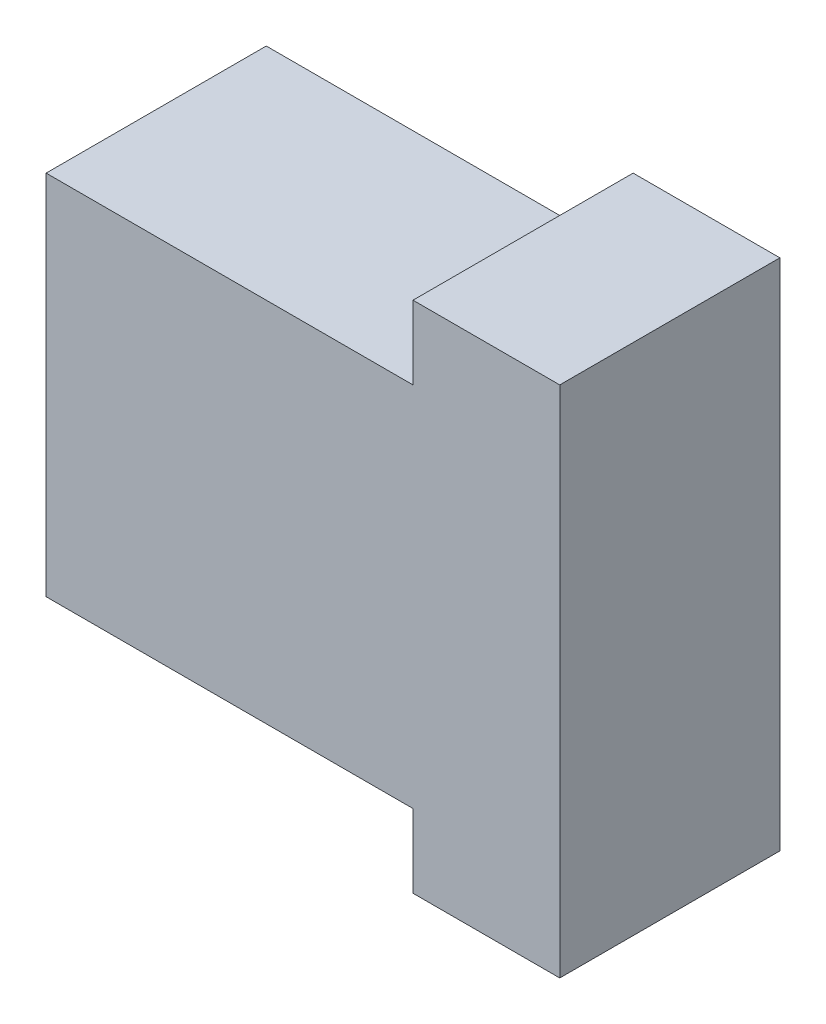
ISO-10303-21;
HEADER;
FILE_DESCRIPTION(('STEP AP214'),'2;1');
FILE_NAME('part.step','',(''),(''),'','','');
FILE_SCHEMA(('AUTOMOTIVE_DESIGN { 1 0 10303 214 1 1 1 1 }'));
ENDSEC;
DATA;
#1=APPLICATION_CONTEXT('core data for automotive mechanical design processes');
#2=APPLICATION_PROTOCOL_DEFINITION('international standard','automotive_design',2000,#1);
#3=PRODUCT_CONTEXT('',#1,'mechanical');
#4=PRODUCT('Part','Part','',(#3));
#5=PRODUCT_RELATED_PRODUCT_CATEGORY('part','',(#4));
#6=PRODUCT_DEFINITION_FORMATION('','',#4);
#7=PRODUCT_DEFINITION_CONTEXT('part definition',#1,'design');
#8=PRODUCT_DEFINITION('design','',#6,#7);
#9=PRODUCT_DEFINITION_SHAPE('','',#8);
#10=(LENGTH_UNIT() NAMED_UNIT(*) SI_UNIT(.MILLI.,.METRE.));
#11=(NAMED_UNIT(*) PLANE_ANGLE_UNIT() SI_UNIT($,.RADIAN.));
#12=(NAMED_UNIT(*) SI_UNIT($,.STERADIAN.) SOLID_ANGLE_UNIT());
#13=UNCERTAINTY_MEASURE_WITH_UNIT(LENGTH_MEASURE(1.E-05),#10,'distance_accuracy_value','');
#14=(GEOMETRIC_REPRESENTATION_CONTEXT(3) GLOBAL_UNCERTAINTY_ASSIGNED_CONTEXT((#13)) GLOBAL_UNIT_ASSIGNED_CONTEXT((#10,
#11,#12)) REPRESENTATION_CONTEXT('',''));
#15=CARTESIAN_POINT('',(0.,0.,0.));
#16=DIRECTION('',(0.,0.,1.));
#17=DIRECTION('',(1.,0.,0.));
#18=AXIS2_PLACEMENT_3D('',#15,#16,#17);
#19=CARTESIAN_POINT('',(0.,3.00225749709108,3.));
#20=DIRECTION('',(0.,1.,0.));
#21=DIRECTION('',(0.,0.,1.));
#22=AXIS2_PLACEMENT_3D('',#19,#20,#21);
#23=PLANE('',#22);
#24=DIRECTION('',(1.,0.,0.));
#25=VECTOR('',#24,1.);
#26=CARTESIAN_POINT('',(0.,3.00225749709108,0.));
#27=LINE('',#26,#25);
#28=CARTESIAN_POINT('',(-12.9538492447736,3.00225749709108,0.));
#29=VERTEX_POINT('',#28);
#30=CARTESIAN_POINT('',(-7.95384924477364,3.00225749709108,0.));
#31=VERTEX_POINT('',#30);
#32=EDGE_CURVE('E147',#29,#31,#27,.T.);
#33=ORIENTED_EDGE('',*,*,#32,.T.);
#34=DIRECTION('',(0.,0.,-1.));
#35=VECTOR('',#34,1.);
#36=CARTESIAN_POINT('',(-7.95384924477364,3.00225749709108,3.));
#37=LINE('',#36,#35);
#38=CARTESIAN_POINT('',(-7.95384924477364,3.00225749709108,3.));
#39=VERTEX_POINT('',#38);
#40=EDGE_CURVE('E11',#39,#31,#37,.T.);
#41=ORIENTED_EDGE('',*,*,#40,.F.);
#42=DIRECTION('',(1.,0.,0.));
#43=VECTOR('',#42,1.);
#44=CARTESIAN_POINT('',(0.,3.00225749709108,3.));
#45=LINE('',#44,#43);
#46=CARTESIAN_POINT('',(-12.9538492447736,3.00225749709108,3.));
#47=VERTEX_POINT('',#46);
#48=EDGE_CURVE('E169',#47,#39,#45,.T.);
#49=ORIENTED_EDGE('',*,*,#48,.F.);
#50=DIRECTION('',(0.,0.,-1.));
#51=VECTOR('',#50,1.);
#52=CARTESIAN_POINT('',(-12.9538492447736,3.00225749709108,3.));
#53=LINE('',#52,#51);
#54=EDGE_CURVE('E141',#47,#29,#53,.T.);
#55=ORIENTED_EDGE('',*,*,#54,.T.);
#56=EDGE_LOOP('',(#33,#41,#49,#55));
#57=FACE_BOUND('',#56,.T.);
#58=ADVANCED_FACE('F44',(#57),#23,.F.);
#59=CARTESIAN_POINT('',(-7.95384924477364,0.,3.));
#60=DIRECTION('',(1.,0.,0.));
#61=DIRECTION('',(0.,1.,0.));
#62=AXIS2_PLACEMENT_3D('',#59,#60,#61);
#63=PLANE('',#62);
#64=DIRECTION('',(0.,-1.,0.));
#65=VECTOR('',#64,1.);
#66=CARTESIAN_POINT('',(-7.95384924477364,0.,0.));
#67=LINE('',#66,#65);
#68=CARTESIAN_POINT('',(-7.95384924477364,2.00225749709108,0.));
#69=VERTEX_POINT('',#68);
#70=EDGE_CURVE('E148',#31,#69,#67,.T.);
#71=ORIENTED_EDGE('',*,*,#70,.T.);
#72=DIRECTION('',(0.,0.,-1.));
#73=VECTOR('',#72,1.);
#74=CARTESIAN_POINT('',(-7.95384924477364,2.00225749709108,3.));
#75=LINE('',#74,#73);
#76=CARTESIAN_POINT('',(-7.95384924477364,2.00225749709108,3.));
#77=VERTEX_POINT('',#76);
#78=EDGE_CURVE('E53',#77,#69,#75,.T.);
#79=ORIENTED_EDGE('',*,*,#78,.F.);
#80=DIRECTION('',(0.,-1.,0.));
#81=VECTOR('',#80,1.);
#82=CARTESIAN_POINT('',(-7.95384924477364,0.,3.));
#83=LINE('',#82,#81);
#84=EDGE_CURVE('E102',#39,#77,#83,.T.);
#85=ORIENTED_EDGE('',*,*,#84,.F.);
#86=ORIENTED_EDGE('',*,*,#40,.T.);
#87=EDGE_LOOP('',(#71,#79,#85,#86));
#88=FACE_BOUND('',#87,.T.);
#89=ADVANCED_FACE('F208',(#88),#63,.F.);
#90=CARTESIAN_POINT('',(0.,2.00225749709108,3.));
#91=DIRECTION('',(0.,1.,0.));
#92=DIRECTION('',(-1.,0.,0.));
#93=AXIS2_PLACEMENT_3D('',#90,#91,#92);
#94=PLANE('',#93);
#95=DIRECTION('',(1.,0.,0.));
#96=VECTOR('',#95,1.);
#97=CARTESIAN_POINT('',(0.,2.00225749709108,0.));
#98=LINE('',#97,#96);
#99=CARTESIAN_POINT('',(-5.95384924477365,2.00225749709108,0.));
#100=VERTEX_POINT('',#99);
#101=EDGE_CURVE('E154',#69,#100,#98,.T.);
#102=ORIENTED_EDGE('',*,*,#101,.T.);
#103=DIRECTION('',(0.,0.,-1.));
#104=VECTOR('',#103,1.);
#105=CARTESIAN_POINT('',(-5.95384924477365,2.00225749709108,3.));
#106=LINE('',#105,#104);
#107=CARTESIAN_POINT('',(-5.95384924477365,2.00225749709108,3.));
#108=VERTEX_POINT('',#107);
#109=EDGE_CURVE('E179',#108,#100,#106,.T.);
#110=ORIENTED_EDGE('',*,*,#109,.F.);
#111=DIRECTION('',(1.,0.,0.));
#112=VECTOR('',#111,1.);
#113=CARTESIAN_POINT('',(0.,2.00225749709108,3.));
#114=LINE('',#113,#112);
#115=EDGE_CURVE('E188',#77,#108,#114,.T.);
#116=ORIENTED_EDGE('',*,*,#115,.F.);
#117=ORIENTED_EDGE('',*,*,#78,.T.);
#118=EDGE_LOOP('',(#102,#110,#116,#117));
#119=FACE_BOUND('',#118,.T.);
#120=ADVANCED_FACE('F190',(#119),#94,.F.);
#121=CARTESIAN_POINT('',(-5.95384924477365,0.,3.));
#122=DIRECTION('',(1.,0.,0.));
#123=DIRECTION('',(0.,0.,-1.));
#124=AXIS2_PLACEMENT_3D('',#121,#122,#123);
#125=PLANE('',#124);
#126=DIRECTION('',(0.,-1.,0.));
#127=VECTOR('',#126,1.);
#128=CARTESIAN_POINT('',(-5.95384924477365,0.,0.));
#129=LINE('',#128,#127);
#130=CARTESIAN_POINT('',(-5.95384924477365,9.00225749709108,0.));
#131=VERTEX_POINT('',#130);
#132=EDGE_CURVE('E160',#131,#100,#129,.T.);
#133=ORIENTED_EDGE('',*,*,#132,.F.);
#134=DIRECTION('',(0.,0.,-1.));
#135=VECTOR('',#134,1.);
#136=CARTESIAN_POINT('',(-5.95384924477365,9.00225749709108,3.));
#137=LINE('',#136,#135);
#138=CARTESIAN_POINT('',(-5.95384924477365,9.00225749709108,3.));
#139=VERTEX_POINT('',#138);
#140=EDGE_CURVE('E180',#139,#131,#137,.T.);
#141=ORIENTED_EDGE('',*,*,#140,.F.);
#142=DIRECTION('',(0.,-1.,0.));
#143=VECTOR('',#142,1.);
#144=CARTESIAN_POINT('',(-5.95384924477365,0.,3.));
#145=LINE('',#144,#143);
#146=EDGE_CURVE('E199',#139,#108,#145,.T.);
#147=ORIENTED_EDGE('',*,*,#146,.T.);
#148=ORIENTED_EDGE('',*,*,#109,.T.);
#149=EDGE_LOOP('',(#133,#141,#147,#148));
#150=FACE_BOUND('',#149,.T.);
#151=ADVANCED_FACE('F196',(#150),#125,.T.);
#152=CARTESIAN_POINT('',(0.,9.00225749709108,3.));
#153=DIRECTION('',(0.,1.,0.));
#154=DIRECTION('',(0.,0.,1.));
#155=AXIS2_PLACEMENT_3D('',#152,#153,#154);
#156=PLANE('',#155);
#157=DIRECTION('',(1.,0.,0.));
#158=VECTOR('',#157,1.);
#159=CARTESIAN_POINT('',(0.,9.00225749709108,0.));
#160=LINE('',#159,#158);
#161=CARTESIAN_POINT('',(-7.95384924477365,9.00225749709108,0.));
#162=VERTEX_POINT('',#161);
#163=EDGE_CURVE('E161',#162,#131,#160,.T.);
#164=ORIENTED_EDGE('',*,*,#163,.F.);
#165=DIRECTION('',(0.,0.,-1.));
#166=VECTOR('',#165,1.);
#167=CARTESIAN_POINT('',(-7.95384924477365,9.00225749709108,3.));
#168=LINE('',#167,#166);
#169=CARTESIAN_POINT('',(-7.95384924477365,9.00225749709108,3.));
#170=VERTEX_POINT('',#169);
#171=EDGE_CURVE('E134',#170,#162,#168,.T.);
#172=ORIENTED_EDGE('',*,*,#171,.F.);
#173=DIRECTION('',(1.,0.,0.));
#174=VECTOR('',#173,1.);
#175=CARTESIAN_POINT('',(0.,9.00225749709108,3.));
#176=LINE('',#175,#174);
#177=EDGE_CURVE('E122',#170,#139,#176,.T.);
#178=ORIENTED_EDGE('',*,*,#177,.T.);
#179=ORIENTED_EDGE('',*,*,#140,.T.);
#180=EDGE_LOOP('',(#164,#172,#178,#179));
#181=FACE_BOUND('',#180,.T.);
#182=ADVANCED_FACE('F219',(#181),#156,.T.);
#183=CARTESIAN_POINT('',(-7.95384924477364,8.00225749709108,0.));
#184=VERTEX_POINT('',#183);
#185=EDGE_CURVE('E127',#162,#184,#67,.T.);
#186=ORIENTED_EDGE('',*,*,#185,.T.);
#187=DIRECTION('',(0.,0.,-1.));
#188=VECTOR('',#187,1.);
#189=CARTESIAN_POINT('',(-7.95384924477364,8.00225749709108,3.));
#190=LINE('',#189,#188);
#191=CARTESIAN_POINT('',(-7.95384924477364,8.00225749709108,3.));
#192=VERTEX_POINT('',#191);
#193=EDGE_CURVE('E130',#192,#184,#190,.T.);
#194=ORIENTED_EDGE('',*,*,#193,.F.);
#195=EDGE_CURVE('E113',#170,#192,#83,.T.);
#196=ORIENTED_EDGE('',*,*,#195,.F.);
#197=ORIENTED_EDGE('',*,*,#171,.T.);
#198=EDGE_LOOP('',(#186,#194,#196,#197));
#199=FACE_BOUND('',#198,.T.);
#200=ADVANCED_FACE('F126',(#199),#63,.F.);
#201=CARTESIAN_POINT('',(0.,8.00225749709108,3.));
#202=DIRECTION('',(0.,1.,0.));
#203=DIRECTION('',(0.,0.,1.));
#204=AXIS2_PLACEMENT_3D('',#201,#202,#203);
#205=PLANE('',#204);
#206=DIRECTION('',(1.,0.,0.));
#207=VECTOR('',#206,1.);
#208=CARTESIAN_POINT('',(0.,8.00225749709108,0.));
#209=LINE('',#208,#207);
#210=CARTESIAN_POINT('',(-12.9538492447736,8.00225749709108,0.));
#211=VERTEX_POINT('',#210);
#212=EDGE_CURVE('E165',#211,#184,#209,.T.);
#213=ORIENTED_EDGE('',*,*,#212,.F.);
#214=DIRECTION('',(0.,0.,-1.));
#215=VECTOR('',#214,1.);
#216=CARTESIAN_POINT('',(-12.9538492447736,8.00225749709108,3.));
#217=LINE('',#216,#215);
#218=CARTESIAN_POINT('',(-12.9538492447736,8.00225749709108,3.));
#219=VERTEX_POINT('',#218);
#220=EDGE_CURVE('E89',#219,#211,#217,.T.);
#221=ORIENTED_EDGE('',*,*,#220,.F.);
#222=DIRECTION('',(1.,0.,0.));
#223=VECTOR('',#222,1.);
#224=CARTESIAN_POINT('',(0.,8.00225749709108,3.));
#225=LINE('',#224,#223);
#226=EDGE_CURVE('E118',#219,#192,#225,.T.);
#227=ORIENTED_EDGE('',*,*,#226,.T.);
#228=ORIENTED_EDGE('',*,*,#193,.T.);
#229=EDGE_LOOP('',(#213,#221,#227,#228));
#230=FACE_BOUND('',#229,.T.);
#231=ADVANCED_FACE('F140',(#230),#205,.T.);
#232=CARTESIAN_POINT('',(-12.9538492447737,0.,3.));
#233=DIRECTION('',(1.,0.,0.));
#234=DIRECTION('',(0.,1.,0.));
#235=AXIS2_PLACEMENT_3D('',#232,#233,#234);
#236=PLANE('',#235);
#237=DIRECTION('',(0.,-1.,0.));
#238=VECTOR('',#237,1.);
#239=CARTESIAN_POINT('',(-12.9538492447737,0.,0.));
#240=LINE('',#239,#238);
#241=EDGE_CURVE('E93',#211,#29,#240,.T.);
#242=ORIENTED_EDGE('',*,*,#241,.T.);
#243=ORIENTED_EDGE('',*,*,#54,.F.);
#244=DIRECTION('',(0.,-1.,0.));
#245=VECTOR('',#244,1.);
#246=CARTESIAN_POINT('',(-12.9538492447737,0.,3.));
#247=LINE('',#246,#245);
#248=EDGE_CURVE('E62',#219,#47,#247,.T.);
#249=ORIENTED_EDGE('',*,*,#248,.F.);
#250=ORIENTED_EDGE('',*,*,#220,.T.);
#251=EDGE_LOOP('',(#242,#243,#249,#250));
#252=FACE_BOUND('',#251,.T.);
#253=ADVANCED_FACE('F222',(#252),#236,.F.);
#254=CARTESIAN_POINT('',(0.,0.,3.));
#255=DIRECTION('',(0.,0.,1.));
#256=DIRECTION('',(1.,0.,0.));
#257=AXIS2_PLACEMENT_3D('',#254,#255,#256);
#258=PLANE('',#257);
#259=ORIENTED_EDGE('',*,*,#48,.T.);
#260=ORIENTED_EDGE('',*,*,#84,.T.);
#261=ORIENTED_EDGE('',*,*,#115,.T.);
#262=ORIENTED_EDGE('',*,*,#146,.F.);
#263=ORIENTED_EDGE('',*,*,#177,.F.);
#264=ORIENTED_EDGE('',*,*,#195,.T.);
#265=ORIENTED_EDGE('',*,*,#226,.F.);
#266=ORIENTED_EDGE('',*,*,#248,.T.);
#267=EDGE_LOOP('',(#259,#260,#261,#262,#263,#264,#265,#266));
#268=FACE_BOUND('',#267,.T.);
#269=ADVANCED_FACE('F117',(#268),#258,.T.);
#270=CARTESIAN_POINT('',(0.,0.,0.));
#271=DIRECTION('',(0.,0.,1.));
#272=DIRECTION('',(1.,0.,0.));
#273=AXIS2_PLACEMENT_3D('',#270,#271,#272);
#274=PLANE('',#273);
#275=ORIENTED_EDGE('',*,*,#32,.F.);
#276=ORIENTED_EDGE('',*,*,#241,.F.);
#277=ORIENTED_EDGE('',*,*,#212,.T.);
#278=ORIENTED_EDGE('',*,*,#185,.F.);
#279=ORIENTED_EDGE('',*,*,#163,.T.);
#280=ORIENTED_EDGE('',*,*,#132,.T.);
#281=ORIENTED_EDGE('',*,*,#101,.F.);
#282=ORIENTED_EDGE('',*,*,#70,.F.);
#283=EDGE_LOOP('',(#275,#276,#277,#278,#279,#280,#281,#282));
#284=FACE_BOUND('',#283,.T.);
#285=ADVANCED_FACE('F195',(#284),#274,.F.);
#286=CLOSED_SHELL('',(#58,#89,#120,#151,#182,#200,#231,#253,#269,#285));
#287=MANIFOLD_SOLID_BREP('B2',#286);
#288=ADVANCED_BREP_SHAPE_REPRESENTATION('',(#18,#287),#14);
#289=SHAPE_DEFINITION_REPRESENTATION(#9,#288);
ENDSEC;
END-ISO-10303-21;
